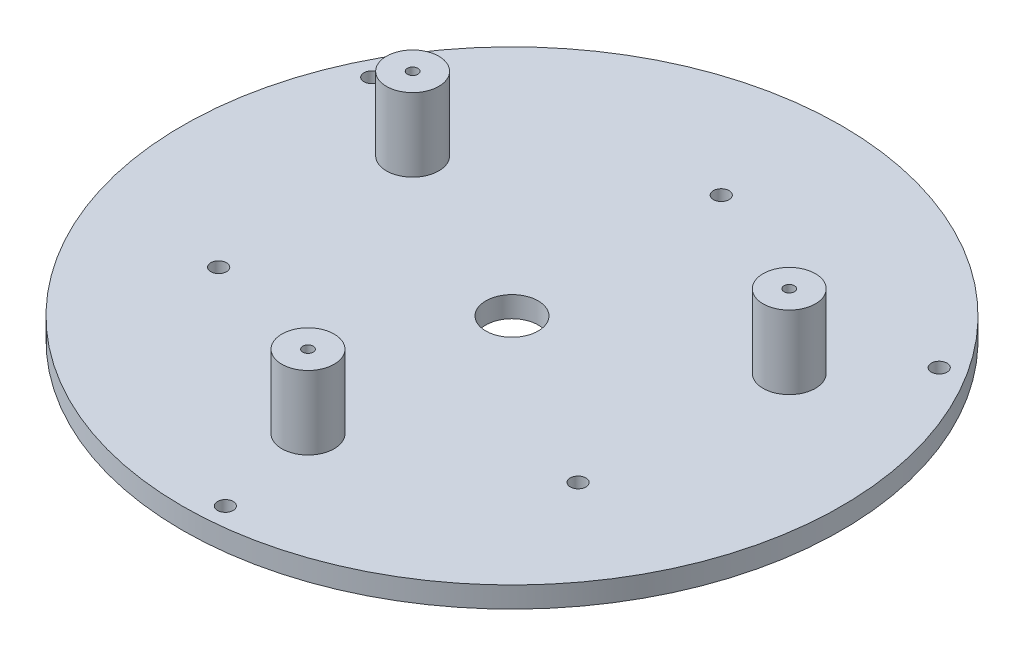
ISO-10303-21;
HEADER;
FILE_DESCRIPTION(('STEP AP214'),'2;1');
FILE_NAME('part.step','',(''),(''),'','','');
FILE_SCHEMA(('AUTOMOTIVE_DESIGN { 1 0 10303 214 1 1 1 1 }'));
ENDSEC;
DATA;
#1=APPLICATION_CONTEXT('core data for automotive mechanical design processes');
#2=APPLICATION_PROTOCOL_DEFINITION('international standard','automotive_design',2000,#1);
#3=PRODUCT_CONTEXT('',#1,'mechanical');
#4=PRODUCT('Part','Part','',(#3));
#5=PRODUCT_RELATED_PRODUCT_CATEGORY('part','',(#4));
#6=PRODUCT_DEFINITION_FORMATION('','',#4);
#7=PRODUCT_DEFINITION_CONTEXT('part definition',#1,'design');
#8=PRODUCT_DEFINITION('design','',#6,#7);
#9=PRODUCT_DEFINITION_SHAPE('','',#8);
#10=(LENGTH_UNIT() NAMED_UNIT(*) SI_UNIT(.MILLI.,.METRE.));
#11=(NAMED_UNIT(*) PLANE_ANGLE_UNIT() SI_UNIT($,.RADIAN.));
#12=(NAMED_UNIT(*) SI_UNIT($,.STERADIAN.) SOLID_ANGLE_UNIT());
#13=UNCERTAINTY_MEASURE_WITH_UNIT(LENGTH_MEASURE(1.E-05),#10,'distance_accuracy_value','');
#14=(GEOMETRIC_REPRESENTATION_CONTEXT(3) GLOBAL_UNCERTAINTY_ASSIGNED_CONTEXT((#13)) GLOBAL_UNIT_ASSIGNED_CONTEXT((#10,
#11,#12)) REPRESENTATION_CONTEXT('',''));
#15=CARTESIAN_POINT('',(0.,0.,0.));
#16=DIRECTION('',(0.,0.,1.));
#17=DIRECTION('',(1.,0.,0.));
#18=AXIS2_PLACEMENT_3D('',#15,#16,#17);
#19=CARTESIAN_POINT('',(0.,4.,0.));
#20=DIRECTION('',(0.,-1.,0.));
#21=DIRECTION('',(0.,0.,-1.));
#22=AXIS2_PLACEMENT_3D('',#19,#20,#21);
#23=CYLINDRICAL_SURFACE('',#22,63.);
#24=CARTESIAN_POINT('',(0.,4.,0.));
#25=DIRECTION('',(0.,1.,0.));
#26=DIRECTION('',(0.,0.,1.));
#27=AXIS2_PLACEMENT_3D('',#24,#25,#26);
#28=CIRCLE('',#27,63.);
#29=CARTESIAN_POINT('',(0.,4.,63.));
#30=VERTEX_POINT('',#29);
#31=EDGE_CURVE('E49',#30,#30,#28,.T.);
#32=ORIENTED_EDGE('',*,*,#31,.F.);
#33=EDGE_LOOP('',(#32));
#34=FACE_BOUND('',#33,.T.);
#35=CARTESIAN_POINT('',(0.,0.,0.));
#36=DIRECTION('',(0.,1.,0.));
#37=DIRECTION('',(0.,0.,1.));
#38=AXIS2_PLACEMENT_3D('',#35,#36,#37);
#39=CIRCLE('',#38,63.);
#40=CARTESIAN_POINT('',(0.,0.,63.));
#41=VERTEX_POINT('',#40);
#42=EDGE_CURVE('E52',#41,#41,#39,.T.);
#43=ORIENTED_EDGE('',*,*,#42,.T.);
#44=EDGE_LOOP('',(#43));
#45=FACE_BOUND('',#44,.T.);
#46=ADVANCED_FACE('F35',(#34,#45),#23,.T.);
#47=CARTESIAN_POINT('',(0.,4.,0.));
#48=DIRECTION('',(0.,1.,0.));
#49=DIRECTION('',(0.,0.,1.));
#50=AXIS2_PLACEMENT_3D('',#47,#48,#49);
#51=PLANE('',#50);
#52=CARTESIAN_POINT('',(4.06318883481198,4.,58.8599226680826));
#53=DIRECTION('',(0.,1.,0.));
#54=DIRECTION('',(0.,0.,1.));
#55=AXIS2_PLACEMENT_3D('',#52,#53,#54);
#56=CIRCLE('',#55,1.5);
#57=CARTESIAN_POINT('',(4.06318883481198,4.,60.3599226680826));
#58=VERTEX_POINT('',#57);
#59=EDGE_CURVE('E98',#58,#58,#56,.F.);
#60=ORIENTED_EDGE('',*,*,#59,.T.);
#61=EDGE_LOOP('',(#60));
#62=FACE_BOUND('',#61,.T.);
#63=CARTESIAN_POINT('',(-52.909524673009,4.,-26.1071292729831));
#64=DIRECTION('',(0.,1.,0.));
#65=DIRECTION('',(0.,0.,1.));
#66=AXIS2_PLACEMENT_3D('',#63,#64,#65);
#67=CIRCLE('',#66,1.5);
#68=CARTESIAN_POINT('',(-52.909524673009,4.,-24.6071292729831));
#69=VERTEX_POINT('',#68);
#70=EDGE_CURVE('E116',#69,#69,#67,.F.);
#71=ORIENTED_EDGE('',*,*,#70,.T.);
#72=EDGE_LOOP('',(#71));
#73=FACE_BOUND('',#72,.T.);
#74=CARTESIAN_POINT('',(49.390475326991,4.,-32.273533227304));
#75=DIRECTION('',(0.,1.,0.));
#76=DIRECTION('',(0.,0.,1.));
#77=AXIS2_PLACEMENT_3D('',#74,#75,#76);
#78=CIRCLE('',#77,1.5);
#79=CARTESIAN_POINT('',(49.390475326991,4.,-30.773533227304));
#80=VERTEX_POINT('',#79);
#81=EDGE_CURVE('E109',#80,#80,#78,.F.);
#82=ORIENTED_EDGE('',*,*,#81,.T.);
#83=EDGE_LOOP('',(#82));
#84=FACE_BOUND('',#83,.T.);
#85=CARTESIAN_POINT('',(33.8886042793149,4.,21.25));
#86=DIRECTION('',(0.,1.,0.));
#87=DIRECTION('',(0.,0.,1.));
#88=AXIS2_PLACEMENT_3D('',#85,#86,#87);
#89=CIRCLE('',#88,1.5);
#90=CARTESIAN_POINT('',(33.8886042793149,4.,22.75));
#91=VERTEX_POINT('',#90);
#92=EDGE_CURVE('E102',#91,#91,#89,.T.);
#93=ORIENTED_EDGE('',*,*,#92,.F.);
#94=EDGE_LOOP('',(#93));
#95=FACE_BOUND('',#94,.T.);
#96=CARTESIAN_POINT('',(-36.0997538421394,4.,19.9733922046847));
#97=DIRECTION('',(0.,1.,0.));
#98=DIRECTION('',(0.,0.,1.));
#99=AXIS2_PLACEMENT_3D('',#96,#97,#98);
#100=CIRCLE('',#99,1.5);
#101=CARTESIAN_POINT('',(-36.0997538421394,4.,21.4733922046847));
#102=VERTEX_POINT('',#101);
#103=EDGE_CURVE('E94',#102,#102,#100,.T.);
#104=ORIENTED_EDGE('',*,*,#103,.F.);
#105=EDGE_LOOP('',(#104));
#106=FACE_BOUND('',#105,.T.);
#107=CARTESIAN_POINT('',(0.,4.,-40.));
#108=DIRECTION('',(0.,1.,0.));
#109=DIRECTION('',(0.,0.,1.));
#110=AXIS2_PLACEMENT_3D('',#107,#108,#109);
#111=CIRCLE('',#110,1.5);
#112=CARTESIAN_POINT('',(0.,4.,-38.5));
#113=VERTEX_POINT('',#112);
#114=EDGE_CURVE('E95',#113,#113,#111,.T.);
#115=ORIENTED_EDGE('',*,*,#114,.F.);
#116=EDGE_LOOP('',(#115));
#117=FACE_BOUND('',#116,.T.);
#118=CARTESIAN_POINT('',(0.,4.,39.));
#119=DIRECTION('',(0.,1.,0.));
#120=DIRECTION('',(0.,0.,1.));
#121=AXIS2_PLACEMENT_3D('',#118,#119,#120);
#122=CIRCLE('',#121,5.);
#123=CARTESIAN_POINT('',(0.,4.,34.));
#124=VERTEX_POINT('',#123);
#125=EDGE_CURVE('E82',#124,#124,#122,.T.);
#126=ORIENTED_EDGE('',*,*,#125,.F.);
#127=EDGE_LOOP('',(#126));
#128=FACE_BOUND('',#127,.T.);
#129=CARTESIAN_POINT('',(36.,4.,-17.));
#130=DIRECTION('',(0.,1.,0.));
#131=DIRECTION('',(0.,0.,1.));
#132=AXIS2_PLACEMENT_3D('',#129,#130,#131);
#133=CIRCLE('',#132,5.);
#134=CARTESIAN_POINT('',(36.,4.,-22.));
#135=VERTEX_POINT('',#134);
#136=EDGE_CURVE('E73',#135,#135,#133,.T.);
#137=ORIENTED_EDGE('',*,*,#136,.F.);
#138=EDGE_LOOP('',(#137));
#139=FACE_BOUND('',#138,.T.);
#140=CARTESIAN_POINT('',(-36.,4.,-17.));
#141=DIRECTION('',(0.,1.,0.));
#142=DIRECTION('',(0.,0.,1.));
#143=AXIS2_PLACEMENT_3D('',#140,#141,#142);
#144=CIRCLE('',#143,5.);
#145=CARTESIAN_POINT('',(-36.,4.,-22.));
#146=VERTEX_POINT('',#145);
#147=EDGE_CURVE('E64',#146,#146,#144,.T.);
#148=ORIENTED_EDGE('',*,*,#147,.F.);
#149=EDGE_LOOP('',(#148));
#150=FACE_BOUND('',#149,.T.);
#151=CARTESIAN_POINT('',(0.,4.,0.));
#152=DIRECTION('',(0.,1.,0.));
#153=DIRECTION('',(0.,0.,1.));
#154=AXIS2_PLACEMENT_3D('',#151,#152,#153);
#155=CIRCLE('',#154,5.);
#156=CARTESIAN_POINT('',(0.,4.,5.));
#157=VERTEX_POINT('',#156);
#158=EDGE_CURVE('E60',#157,#157,#155,.T.);
#159=ORIENTED_EDGE('',*,*,#158,.F.);
#160=EDGE_LOOP('',(#159));
#161=FACE_BOUND('',#160,.T.);
#162=ORIENTED_EDGE('',*,*,#31,.T.);
#163=EDGE_LOOP('',(#162));
#164=FACE_BOUND('',#163,.T.);
#165=ADVANCED_FACE('F134',(#62,#73,#84,#95,#106,#117,#128,#139,#150,#161,#164),#51,.T.);
#166=CARTESIAN_POINT('',(0.,0.,0.));
#167=DIRECTION('',(0.,1.,0.));
#168=DIRECTION('',(0.,0.,1.));
#169=AXIS2_PLACEMENT_3D('',#166,#167,#168);
#170=PLANE('',#169);
#171=CARTESIAN_POINT('',(4.06318883481198,0.,58.8599226680826));
#172=DIRECTION('',(0.,-1.,0.));
#173=DIRECTION('',(0.,0.,-1.));
#174=AXIS2_PLACEMENT_3D('',#171,#172,#173);
#175=CIRCLE('',#174,1.5);
#176=CARTESIAN_POINT('',(4.06318883481198,0.,57.3599226680826));
#177=VERTEX_POINT('',#176);
#178=EDGE_CURVE('E119',#177,#177,#175,.T.);
#179=ORIENTED_EDGE('',*,*,#178,.F.);
#180=EDGE_LOOP('',(#179));
#181=FACE_BOUND('',#180,.T.);
#182=CARTESIAN_POINT('',(-52.909524673009,0.,-26.1071292729831));
#183=DIRECTION('',(0.,-1.,0.));
#184=DIRECTION('',(0.,0.,-1.));
#185=AXIS2_PLACEMENT_3D('',#182,#183,#184);
#186=CIRCLE('',#185,1.5);
#187=CARTESIAN_POINT('',(-52.909524673009,0.,-27.6071292729831));
#188=VERTEX_POINT('',#187);
#189=EDGE_CURVE('E112',#188,#188,#186,.T.);
#190=ORIENTED_EDGE('',*,*,#189,.F.);
#191=EDGE_LOOP('',(#190));
#192=FACE_BOUND('',#191,.T.);
#193=CARTESIAN_POINT('',(49.390475326991,0.,-32.273533227304));
#194=DIRECTION('',(0.,-1.,0.));
#195=DIRECTION('',(0.,0.,-1.));
#196=AXIS2_PLACEMENT_3D('',#193,#194,#195);
#197=CIRCLE('',#196,1.5);
#198=CARTESIAN_POINT('',(49.390475326991,0.,-33.773533227304));
#199=VERTEX_POINT('',#198);
#200=EDGE_CURVE('E113',#199,#199,#197,.T.);
#201=ORIENTED_EDGE('',*,*,#200,.F.);
#202=EDGE_LOOP('',(#201));
#203=FACE_BOUND('',#202,.T.);
#204=CARTESIAN_POINT('',(33.8886042793149,0.,21.25));
#205=DIRECTION('',(0.,1.,0.));
#206=DIRECTION('',(0.,0.,1.));
#207=AXIS2_PLACEMENT_3D('',#204,#205,#206);
#208=CIRCLE('',#207,1.5);
#209=CARTESIAN_POINT('',(33.8886042793149,0.,22.75));
#210=VERTEX_POINT('',#209);
#211=EDGE_CURVE('E90',#210,#210,#208,.F.);
#212=ORIENTED_EDGE('',*,*,#211,.F.);
#213=EDGE_LOOP('',(#212));
#214=FACE_BOUND('',#213,.T.);
#215=CARTESIAN_POINT('',(-36.0997538421394,0.,19.9733922046847));
#216=DIRECTION('',(0.,1.,0.));
#217=DIRECTION('',(0.,0.,1.));
#218=AXIS2_PLACEMENT_3D('',#215,#216,#217);
#219=CIRCLE('',#218,1.5);
#220=CARTESIAN_POINT('',(-36.0997538421394,0.,21.4733922046847));
#221=VERTEX_POINT('',#220);
#222=EDGE_CURVE('E99',#221,#221,#219,.F.);
#223=ORIENTED_EDGE('',*,*,#222,.F.);
#224=EDGE_LOOP('',(#223));
#225=FACE_BOUND('',#224,.T.);
#226=CARTESIAN_POINT('',(0.,0.,-40.));
#227=DIRECTION('',(0.,1.,0.));
#228=DIRECTION('',(0.,0.,1.));
#229=AXIS2_PLACEMENT_3D('',#226,#227,#228);
#230=CIRCLE('',#229,1.5);
#231=CARTESIAN_POINT('',(0.,0.,-38.5));
#232=VERTEX_POINT('',#231);
#233=EDGE_CURVE('E91',#232,#232,#230,.F.);
#234=ORIENTED_EDGE('',*,*,#233,.F.);
#235=EDGE_LOOP('',(#234));
#236=FACE_BOUND('',#235,.T.);
#237=CARTESIAN_POINT('',(0.,0.,0.));
#238=DIRECTION('',(0.,1.,0.));
#239=DIRECTION('',(0.,0.,1.));
#240=AXIS2_PLACEMENT_3D('',#237,#238,#239);
#241=CIRCLE('',#240,5.);
#242=CARTESIAN_POINT('',(0.,0.,5.));
#243=VERTEX_POINT('',#242);
#244=EDGE_CURVE('E55',#243,#243,#241,.F.);
#245=ORIENTED_EDGE('',*,*,#244,.F.);
#246=EDGE_LOOP('',(#245));
#247=FACE_BOUND('',#246,.T.);
#248=ORIENTED_EDGE('',*,*,#42,.F.);
#249=EDGE_LOOP('',(#248));
#250=FACE_BOUND('',#249,.T.);
#251=ADVANCED_FACE('F130',(#181,#192,#203,#214,#225,#236,#247,#250),#170,.F.);
#252=CARTESIAN_POINT('',(0.,-14.1421356237309,0.));
#253=DIRECTION('',(0.,1.,0.));
#254=DIRECTION('',(0.,0.,1.));
#255=AXIS2_PLACEMENT_3D('',#252,#253,#254);
#256=CYLINDRICAL_SURFACE('',#255,5.);
#257=ORIENTED_EDGE('',*,*,#244,.T.);
#258=EDGE_LOOP('',(#257));
#259=FACE_BOUND('',#258,.T.);
#260=ORIENTED_EDGE('',*,*,#158,.T.);
#261=EDGE_LOOP('',(#260));
#262=FACE_BOUND('',#261,.T.);
#263=ADVANCED_FACE('F133',(#259,#262),#256,.F.);
#264=CARTESIAN_POINT('',(-36.,18.,-17.));
#265=DIRECTION('',(0.,1.,0.));
#266=DIRECTION('',(0.,0.,1.));
#267=AXIS2_PLACEMENT_3D('',#264,#265,#266);
#268=PLANE('',#267);
#269=CARTESIAN_POINT('',(-36.,18.,-17.));
#270=DIRECTION('',(0.,1.,0.));
#271=DIRECTION('',(0.,0.,1.));
#272=AXIS2_PLACEMENT_3D('',#269,#270,#271);
#273=CIRCLE('',#272,5.);
#274=CARTESIAN_POINT('',(-36.,18.,-22.));
#275=VERTEX_POINT('',#274);
#276=EDGE_CURVE('E63',#275,#275,#273,.T.);
#277=ORIENTED_EDGE('',*,*,#276,.T.);
#278=EDGE_LOOP('',(#277));
#279=FACE_BOUND('',#278,.T.);
#280=CARTESIAN_POINT('',(-36.,18.,-17.));
#281=DIRECTION('',(0.,1.,0.));
#282=DIRECTION('',(0.,0.,1.));
#283=AXIS2_PLACEMENT_3D('',#280,#281,#282);
#284=CIRCLE('',#283,0.999999999999998);
#285=CARTESIAN_POINT('',(-36.,18.,-18.));
#286=VERTEX_POINT('',#285);
#287=EDGE_CURVE('E67',#286,#286,#284,.T.);
#288=ORIENTED_EDGE('',*,*,#287,.F.);
#289=EDGE_LOOP('',(#288));
#290=FACE_BOUND('',#289,.T.);
#291=ADVANCED_FACE('F204',(#279,#290),#268,.T.);
#292=CARTESIAN_POINT('',(-36.,18.,-17.));
#293=DIRECTION('',(0.,-1.,0.));
#294=DIRECTION('',(0.,0.,-1.));
#295=AXIS2_PLACEMENT_3D('',#292,#293,#294);
#296=CYLINDRICAL_SURFACE('',#295,5.);
#297=CARTESIAN_POINT('',(-36.,18.,-22.));
#298=CARTESIAN_POINT('',(-36.,17.8541666666667,-22.));
#299=CARTESIAN_POINT('',(-36.,17.7083333333333,-22.));
#300=CARTESIAN_POINT('',(-36.,17.4166666666667,-22.));
#301=CARTESIAN_POINT('',(-36.,17.2708333333333,-22.));
#302=CARTESIAN_POINT('',(-36.,16.9791666666667,-22.));
#303=CARTESIAN_POINT('',(-36.,16.8333333333333,-22.));
#304=CARTESIAN_POINT('',(-36.,16.5416666666667,-22.));
#305=CARTESIAN_POINT('',(-36.,16.3958333333333,-22.));
#306=CARTESIAN_POINT('',(-36.,16.1041666666667,-22.));
#307=CARTESIAN_POINT('',(-36.,15.9583333333333,-22.));
#308=CARTESIAN_POINT('',(-36.,15.6666666666667,-22.));
#309=CARTESIAN_POINT('',(-36.,15.5208333333333,-22.));
#310=CARTESIAN_POINT('',(-36.,15.2291666666667,-22.));
#311=CARTESIAN_POINT('',(-36.,15.0833333333333,-22.));
#312=CARTESIAN_POINT('',(-36.,14.7916666666667,-22.));
#313=CARTESIAN_POINT('',(-36.,14.6458333333333,-22.));
#314=CARTESIAN_POINT('',(-36.,14.3541666666667,-22.));
#315=CARTESIAN_POINT('',(-36.,14.2083333333333,-22.));
#316=CARTESIAN_POINT('',(-36.,13.9166666666667,-22.));
#317=CARTESIAN_POINT('',(-36.,13.7708333333333,-22.));
#318=CARTESIAN_POINT('',(-36.,13.4791666666667,-22.));
#319=CARTESIAN_POINT('',(-36.,13.3333333333333,-22.));
#320=CARTESIAN_POINT('',(-36.,13.0416666666667,-22.));
#321=CARTESIAN_POINT('',(-36.,12.8958333333333,-22.));
#322=CARTESIAN_POINT('',(-36.,12.6041666666667,-22.));
#323=CARTESIAN_POINT('',(-36.,12.4583333333333,-22.));
#324=CARTESIAN_POINT('',(-36.,12.1666666666667,-22.));
#325=CARTESIAN_POINT('',(-36.,12.0208333333333,-22.));
#326=CARTESIAN_POINT('',(-36.,11.7291666666667,-22.));
#327=CARTESIAN_POINT('',(-36.,11.5833333333333,-22.));
#328=CARTESIAN_POINT('',(-36.,11.2916666666667,-22.));
#329=CARTESIAN_POINT('',(-36.,11.1458333333333,-22.));
#330=CARTESIAN_POINT('',(-36.,10.8541666666667,-22.));
#331=CARTESIAN_POINT('',(-36.,10.7083333333333,-22.));
#332=CARTESIAN_POINT('',(-36.,10.4166666666667,-22.));
#333=CARTESIAN_POINT('',(-36.,10.2708333333333,-22.));
#334=CARTESIAN_POINT('',(-36.,9.97916666666667,-22.));
#335=CARTESIAN_POINT('',(-36.,9.83333333333333,-22.));
#336=CARTESIAN_POINT('',(-36.,9.54166666666667,-22.));
#337=CARTESIAN_POINT('',(-36.,9.39583333333333,-22.));
#338=CARTESIAN_POINT('',(-36.,9.10416666666666,-22.));
#339=CARTESIAN_POINT('',(-36.,8.95833333333333,-22.));
#340=CARTESIAN_POINT('',(-36.,8.66666666666667,-22.));
#341=CARTESIAN_POINT('',(-36.,8.52083333333333,-22.));
#342=CARTESIAN_POINT('',(-36.,8.22916666666667,-22.));
#343=CARTESIAN_POINT('',(-36.,8.08333333333333,-22.));
#344=CARTESIAN_POINT('',(-36.,7.79166666666666,-22.));
#345=CARTESIAN_POINT('',(-36.,7.64583333333333,-22.));
#346=CARTESIAN_POINT('',(-36.,7.35416666666666,-22.));
#347=CARTESIAN_POINT('',(-36.,7.20833333333333,-22.));
#348=CARTESIAN_POINT('',(-36.,6.91666666666666,-22.));
#349=CARTESIAN_POINT('',(-36.,6.77083333333333,-22.));
#350=CARTESIAN_POINT('',(-36.,6.47916666666667,-22.));
#351=CARTESIAN_POINT('',(-36.,6.33333333333333,-22.));
#352=CARTESIAN_POINT('',(-36.,6.04166666666667,-22.));
#353=CARTESIAN_POINT('',(-36.,5.89583333333333,-22.));
#354=CARTESIAN_POINT('',(-36.,5.60416666666666,-22.));
#355=CARTESIAN_POINT('',(-36.,5.45833333333333,-22.));
#356=CARTESIAN_POINT('',(-36.,5.16666666666667,-22.));
#357=CARTESIAN_POINT('',(-36.,5.02083333333333,-22.));
#358=CARTESIAN_POINT('',(-36.,4.72916666666667,-22.));
#359=CARTESIAN_POINT('',(-36.,4.58333333333333,-22.));
#360=CARTESIAN_POINT('',(-36.,4.29166666666667,-22.));
#361=CARTESIAN_POINT('',(-36.,4.14583333333333,-22.));
#362=CARTESIAN_POINT('',(-36.,4.,-22.));
#363=B_SPLINE_CURVE_WITH_KNOTS('',3,(#297,#298,#299,#300,#301,#302,#303,#304,#305,#306,#307,
#308,#309,#310,#311,#312,#313,#314,#315,#316,#317,#318,#319,#320,#321,#322,#323,#324,#325,#326,
#327,#328,#329,#330,#331,#332,#333,#334,#335,#336,#337,#338,#339,#340,#341,#342,#343,#344,#345,
#346,#347,#348,#349,#350,#351,#352,#353,#354,#355,#356,#357,#358,#359,#360,#361,#362),
.UNSPECIFIED.,.F.,.F.,(4,2,2,2,2,2,2,2,2,2,2,2,2,2,2,2,2,2,2,2,2,2,2,2,2,2,2,2,2,2,2,2,4),(0.,
0.437499999999997,0.874999999999997,1.3125,1.75,2.1875,2.625,3.0625,3.5,3.9375,4.375,4.8125,
5.25,5.6875,6.125,6.5625,7.,7.4375,7.875,8.3125,8.75,9.1875,9.625,10.0625,10.5,10.9375,11.375,
11.8125,12.25,12.6875,13.125,13.5625,14.),.UNSPECIFIED.);
#364=EDGE_CURVE('BSEAM180',#275,#146,#363,.T.);
#365=ORIENTED_EDGE('',*,*,#276,.F.);
#366=ORIENTED_EDGE('',*,*,#147,.T.);
#367=ORIENTED_EDGE('',*,*,#364,.T.);
#368=ORIENTED_EDGE('',*,*,#364,.F.);
#369=EDGE_LOOP('',(#365,#367,#366,#368));
#370=FACE_BOUND('',#369,.T.);
#371=ADVANCED_FACE('F180',(#370),#296,.T.);
#372=CARTESIAN_POINT('',(-36.,18.,-17.));
#373=DIRECTION('',(0.,-1.,0.));
#374=DIRECTION('',(0.,0.,-1.));
#375=AXIS2_PLACEMENT_3D('',#372,#373,#374);
#376=CYLINDRICAL_SURFACE('',#375,0.999999999999998);
#377=CARTESIAN_POINT('',(-36.,4.,-17.));
#378=DIRECTION('',(0.,1.,0.));
#379=DIRECTION('',(0.,0.,1.));
#380=AXIS2_PLACEMENT_3D('',#377,#378,#379);
#381=CIRCLE('',#380,0.999999999999998);
#382=CARTESIAN_POINT('',(-36.,4.,-18.));
#383=VERTEX_POINT('',#382);
#384=EDGE_CURVE('E45',#383,#383,#381,.F.);
#385=CARTESIAN_POINT('',(-36.,18.,-18.));
#386=CARTESIAN_POINT('',(-36.,17.8541666666667,-18.));
#387=CARTESIAN_POINT('',(-36.,17.7083333333333,-18.));
#388=CARTESIAN_POINT('',(-36.,17.4166666666667,-18.));
#389=CARTESIAN_POINT('',(-36.,17.2708333333333,-18.));
#390=CARTESIAN_POINT('',(-36.,16.9791666666667,-18.));
#391=CARTESIAN_POINT('',(-36.,16.8333333333333,-18.));
#392=CARTESIAN_POINT('',(-36.,16.5416666666667,-18.));
#393=CARTESIAN_POINT('',(-36.,16.3958333333333,-18.));
#394=CARTESIAN_POINT('',(-36.,16.1041666666667,-18.));
#395=CARTESIAN_POINT('',(-36.,15.9583333333333,-18.));
#396=CARTESIAN_POINT('',(-36.,15.6666666666667,-18.));
#397=CARTESIAN_POINT('',(-36.,15.5208333333333,-18.));
#398=CARTESIAN_POINT('',(-36.,15.2291666666667,-18.));
#399=CARTESIAN_POINT('',(-36.,15.0833333333333,-18.));
#400=CARTESIAN_POINT('',(-36.,14.7916666666667,-18.));
#401=CARTESIAN_POINT('',(-36.,14.6458333333333,-18.));
#402=CARTESIAN_POINT('',(-36.,14.3541666666667,-18.));
#403=CARTESIAN_POINT('',(-36.,14.2083333333333,-18.));
#404=CARTESIAN_POINT('',(-36.,13.9166666666667,-18.));
#405=CARTESIAN_POINT('',(-36.,13.7708333333333,-18.));
#406=CARTESIAN_POINT('',(-36.,13.4791666666667,-18.));
#407=CARTESIAN_POINT('',(-36.,13.3333333333333,-18.));
#408=CARTESIAN_POINT('',(-36.,13.0416666666667,-18.));
#409=CARTESIAN_POINT('',(-36.,12.8958333333333,-18.));
#410=CARTESIAN_POINT('',(-36.,12.6041666666667,-18.));
#411=CARTESIAN_POINT('',(-36.,12.4583333333333,-18.));
#412=CARTESIAN_POINT('',(-36.,12.1666666666667,-18.));
#413=CARTESIAN_POINT('',(-36.,12.0208333333333,-18.));
#414=CARTESIAN_POINT('',(-36.,11.7291666666667,-18.));
#415=CARTESIAN_POINT('',(-36.,11.5833333333333,-18.));
#416=CARTESIAN_POINT('',(-36.,11.2916666666667,-18.));
#417=CARTESIAN_POINT('',(-36.,11.1458333333333,-18.));
#418=CARTESIAN_POINT('',(-36.,10.8541666666667,-18.));
#419=CARTESIAN_POINT('',(-36.,10.7083333333333,-18.));
#420=CARTESIAN_POINT('',(-36.,10.4166666666667,-18.));
#421=CARTESIAN_POINT('',(-36.,10.2708333333333,-18.));
#422=CARTESIAN_POINT('',(-36.,9.97916666666667,-18.));
#423=CARTESIAN_POINT('',(-36.,9.83333333333333,-18.));
#424=CARTESIAN_POINT('',(-36.,9.54166666666667,-18.));
#425=CARTESIAN_POINT('',(-36.,9.39583333333333,-18.));
#426=CARTESIAN_POINT('',(-36.,9.10416666666666,-18.));
#427=CARTESIAN_POINT('',(-36.,8.95833333333333,-18.));
#428=CARTESIAN_POINT('',(-36.,8.66666666666667,-18.));
#429=CARTESIAN_POINT('',(-36.,8.52083333333333,-18.));
#430=CARTESIAN_POINT('',(-36.,8.22916666666667,-18.));
#431=CARTESIAN_POINT('',(-36.,8.08333333333333,-18.));
#432=CARTESIAN_POINT('',(-36.,7.79166666666666,-18.));
#433=CARTESIAN_POINT('',(-36.,7.64583333333333,-18.));
#434=CARTESIAN_POINT('',(-36.,7.35416666666666,-18.));
#435=CARTESIAN_POINT('',(-36.,7.20833333333333,-18.));
#436=CARTESIAN_POINT('',(-36.,6.91666666666666,-18.));
#437=CARTESIAN_POINT('',(-36.,6.77083333333333,-18.));
#438=CARTESIAN_POINT('',(-36.,6.47916666666667,-18.));
#439=CARTESIAN_POINT('',(-36.,6.33333333333333,-18.));
#440=CARTESIAN_POINT('',(-36.,6.04166666666667,-18.));
#441=CARTESIAN_POINT('',(-36.,5.89583333333333,-18.));
#442=CARTESIAN_POINT('',(-36.,5.60416666666666,-18.));
#443=CARTESIAN_POINT('',(-36.,5.45833333333333,-18.));
#444=CARTESIAN_POINT('',(-36.,5.16666666666667,-18.));
#445=CARTESIAN_POINT('',(-36.,5.02083333333333,-18.));
#446=CARTESIAN_POINT('',(-36.,4.72916666666667,-18.));
#447=CARTESIAN_POINT('',(-36.,4.58333333333333,-18.));
#448=CARTESIAN_POINT('',(-36.,4.29166666666667,-18.));
#449=CARTESIAN_POINT('',(-36.,4.14583333333333,-18.));
#450=CARTESIAN_POINT('',(-36.,4.,-18.));
#451=B_SPLINE_CURVE_WITH_KNOTS('',3,(#385,#386,#387,#388,#389,#390,#391,#392,#393,#394,#395,
#396,#397,#398,#399,#400,#401,#402,#403,#404,#405,#406,#407,#408,#409,#410,#411,#412,#413,#414,
#415,#416,#417,#418,#419,#420,#421,#422,#423,#424,#425,#426,#427,#428,#429,#430,#431,#432,#433,
#434,#435,#436,#437,#438,#439,#440,#441,#442,#443,#444,#445,#446,#447,#448,#449,#450),
.UNSPECIFIED.,.F.,.F.,(4,2,2,2,2,2,2,2,2,2,2,2,2,2,2,2,2,2,2,2,2,2,2,2,2,2,2,2,2,2,2,2,4),(0.,
0.437499999999997,0.874999999999997,1.3125,1.75,2.1875,2.625,3.0625,3.5,3.9375,4.375,4.8125,
5.25,5.6875,6.125,6.5625,7.,7.4375,7.875,8.3125,8.75,9.1875,9.625,10.0625,10.5,10.9375,11.375,
11.8125,12.25,12.6875,13.125,13.5625,14.),.UNSPECIFIED.);
#452=EDGE_CURVE('BSEAM171',#286,#383,#451,.T.);
#453=ORIENTED_EDGE('',*,*,#287,.T.);
#454=ORIENTED_EDGE('',*,*,#384,.T.);
#455=ORIENTED_EDGE('',*,*,#452,.T.);
#456=ORIENTED_EDGE('',*,*,#452,.F.);
#457=EDGE_LOOP('',(#453,#455,#454,#456));
#458=FACE_BOUND('',#457,.T.);
#459=ADVANCED_FACE('F171',(#458),#376,.F.);
#460=ORIENTED_EDGE('',*,*,#384,.F.);
#461=EDGE_LOOP('',(#460));
#462=FACE_BOUND('',#461,.T.);
#463=ADVANCED_FACE('F157',(#462),#51,.T.);
#464=CARTESIAN_POINT('',(36.,18.,-17.));
#465=DIRECTION('',(0.,1.,0.));
#466=DIRECTION('',(0.,0.,1.));
#467=AXIS2_PLACEMENT_3D('',#464,#465,#466);
#468=PLANE('',#467);
#469=CARTESIAN_POINT('',(36.,18.,-17.));
#470=DIRECTION('',(0.,1.,0.));
#471=DIRECTION('',(0.,0.,1.));
#472=AXIS2_PLACEMENT_3D('',#469,#470,#471);
#473=CIRCLE('',#472,5.);
#474=CARTESIAN_POINT('',(36.,18.,-22.));
#475=VERTEX_POINT('',#474);
#476=EDGE_CURVE('E72',#475,#475,#473,.T.);
#477=ORIENTED_EDGE('',*,*,#476,.T.);
#478=EDGE_LOOP('',(#477));
#479=FACE_BOUND('',#478,.T.);
#480=CARTESIAN_POINT('',(36.,18.,-17.));
#481=DIRECTION('',(0.,1.,0.));
#482=DIRECTION('',(0.,0.,1.));
#483=AXIS2_PLACEMENT_3D('',#480,#481,#482);
#484=CIRCLE('',#483,0.999999999999998);
#485=CARTESIAN_POINT('',(36.,18.,-18.));
#486=VERTEX_POINT('',#485);
#487=EDGE_CURVE('E76',#486,#486,#484,.T.);
#488=ORIENTED_EDGE('',*,*,#487,.F.);
#489=EDGE_LOOP('',(#488));
#490=FACE_BOUND('',#489,.T.);
#491=ADVANCED_FACE('F170',(#479,#490),#468,.T.);
#492=CARTESIAN_POINT('',(36.,18.,-17.));
#493=DIRECTION('',(0.,-1.,0.));
#494=DIRECTION('',(0.,0.,-1.));
#495=AXIS2_PLACEMENT_3D('',#492,#493,#494);
#496=CYLINDRICAL_SURFACE('',#495,5.);
#497=CARTESIAN_POINT('',(36.,18.,-22.));
#498=CARTESIAN_POINT('',(36.,17.8541666666667,-22.));
#499=CARTESIAN_POINT('',(36.,17.7083333333333,-22.));
#500=CARTESIAN_POINT('',(36.,17.4166666666667,-22.));
#501=CARTESIAN_POINT('',(36.,17.2708333333333,-22.));
#502=CARTESIAN_POINT('',(36.,16.9791666666667,-22.));
#503=CARTESIAN_POINT('',(36.,16.8333333333333,-22.));
#504=CARTESIAN_POINT('',(36.,16.5416666666667,-22.));
#505=CARTESIAN_POINT('',(36.,16.3958333333333,-22.));
#506=CARTESIAN_POINT('',(36.,16.1041666666667,-22.));
#507=CARTESIAN_POINT('',(36.,15.9583333333333,-22.));
#508=CARTESIAN_POINT('',(36.,15.6666666666667,-22.));
#509=CARTESIAN_POINT('',(36.,15.5208333333333,-22.));
#510=CARTESIAN_POINT('',(36.,15.2291666666667,-22.));
#511=CARTESIAN_POINT('',(36.,15.0833333333333,-22.));
#512=CARTESIAN_POINT('',(36.,14.7916666666667,-22.));
#513=CARTESIAN_POINT('',(36.,14.6458333333333,-22.));
#514=CARTESIAN_POINT('',(36.,14.3541666666667,-22.));
#515=CARTESIAN_POINT('',(36.,14.2083333333333,-22.));
#516=CARTESIAN_POINT('',(36.,13.9166666666667,-22.));
#517=CARTESIAN_POINT('',(36.,13.7708333333333,-22.));
#518=CARTESIAN_POINT('',(36.,13.4791666666667,-22.));
#519=CARTESIAN_POINT('',(36.,13.3333333333333,-22.));
#520=CARTESIAN_POINT('',(36.,13.0416666666667,-22.));
#521=CARTESIAN_POINT('',(36.,12.8958333333333,-22.));
#522=CARTESIAN_POINT('',(36.,12.6041666666667,-22.));
#523=CARTESIAN_POINT('',(36.,12.4583333333333,-22.));
#524=CARTESIAN_POINT('',(36.,12.1666666666667,-22.));
#525=CARTESIAN_POINT('',(36.,12.0208333333333,-22.));
#526=CARTESIAN_POINT('',(36.,11.7291666666667,-22.));
#527=CARTESIAN_POINT('',(36.,11.5833333333333,-22.));
#528=CARTESIAN_POINT('',(36.,11.2916666666667,-22.));
#529=CARTESIAN_POINT('',(36.,11.1458333333333,-22.));
#530=CARTESIAN_POINT('',(36.,10.8541666666667,-22.));
#531=CARTESIAN_POINT('',(36.,10.7083333333333,-22.));
#532=CARTESIAN_POINT('',(36.,10.4166666666667,-22.));
#533=CARTESIAN_POINT('',(36.,10.2708333333333,-22.));
#534=CARTESIAN_POINT('',(36.,9.97916666666667,-22.));
#535=CARTESIAN_POINT('',(36.,9.83333333333333,-22.));
#536=CARTESIAN_POINT('',(36.,9.54166666666667,-22.));
#537=CARTESIAN_POINT('',(36.,9.39583333333333,-22.));
#538=CARTESIAN_POINT('',(36.,9.10416666666666,-22.));
#539=CARTESIAN_POINT('',(36.,8.95833333333333,-22.));
#540=CARTESIAN_POINT('',(36.,8.66666666666667,-22.));
#541=CARTESIAN_POINT('',(36.,8.52083333333333,-22.));
#542=CARTESIAN_POINT('',(36.,8.22916666666667,-22.));
#543=CARTESIAN_POINT('',(36.,8.08333333333333,-22.));
#544=CARTESIAN_POINT('',(36.,7.79166666666666,-22.));
#545=CARTESIAN_POINT('',(36.,7.64583333333333,-22.));
#546=CARTESIAN_POINT('',(36.,7.35416666666666,-22.));
#547=CARTESIAN_POINT('',(36.,7.20833333333333,-22.));
#548=CARTESIAN_POINT('',(36.,6.91666666666666,-22.));
#549=CARTESIAN_POINT('',(36.,6.77083333333333,-22.));
#550=CARTESIAN_POINT('',(36.,6.47916666666667,-22.));
#551=CARTESIAN_POINT('',(36.,6.33333333333333,-22.));
#552=CARTESIAN_POINT('',(36.,6.04166666666667,-22.));
#553=CARTESIAN_POINT('',(36.,5.89583333333333,-22.));
#554=CARTESIAN_POINT('',(36.,5.60416666666666,-22.));
#555=CARTESIAN_POINT('',(36.,5.45833333333333,-22.));
#556=CARTESIAN_POINT('',(36.,5.16666666666667,-22.));
#557=CARTESIAN_POINT('',(36.,5.02083333333333,-22.));
#558=CARTESIAN_POINT('',(36.,4.72916666666667,-22.));
#559=CARTESIAN_POINT('',(36.,4.58333333333333,-22.));
#560=CARTESIAN_POINT('',(36.,4.29166666666667,-22.));
#561=CARTESIAN_POINT('',(36.,4.14583333333333,-22.));
#562=CARTESIAN_POINT('',(36.,4.,-22.));
#563=B_SPLINE_CURVE_WITH_KNOTS('',3,(#497,#498,#499,#500,#501,#502,#503,#504,#505,#506,#507,
#508,#509,#510,#511,#512,#513,#514,#515,#516,#517,#518,#519,#520,#521,#522,#523,#524,#525,#526,
#527,#528,#529,#530,#531,#532,#533,#534,#535,#536,#537,#538,#539,#540,#541,#542,#543,#544,#545,
#546,#547,#548,#549,#550,#551,#552,#553,#554,#555,#556,#557,#558,#559,#560,#561,#562),
.UNSPECIFIED.,.F.,.F.,(4,2,2,2,2,2,2,2,2,2,2,2,2,2,2,2,2,2,2,2,2,2,2,2,2,2,2,2,2,2,2,2,4),(0.,
0.437499999999997,0.874999999999997,1.3125,1.75,2.1875,2.625,3.0625,3.5,3.9375,4.375,4.8125,
5.25,5.6875,6.125,6.5625,7.,7.4375,7.875,8.3125,8.75,9.1875,9.625,10.0625,10.5,10.9375,11.375,
11.8125,12.25,12.6875,13.125,13.5625,14.),.UNSPECIFIED.);
#564=EDGE_CURVE('BSEAM177',#475,#135,#563,.T.);
#565=ORIENTED_EDGE('',*,*,#476,.F.);
#566=ORIENTED_EDGE('',*,*,#136,.T.);
#567=ORIENTED_EDGE('',*,*,#564,.T.);
#568=ORIENTED_EDGE('',*,*,#564,.F.);
#569=EDGE_LOOP('',(#565,#567,#566,#568));
#570=FACE_BOUND('',#569,.T.);
#571=ADVANCED_FACE('F177',(#570),#496,.T.);
#572=CARTESIAN_POINT('',(36.,18.,-17.));
#573=DIRECTION('',(0.,-1.,0.));
#574=DIRECTION('',(0.,0.,-1.));
#575=AXIS2_PLACEMENT_3D('',#572,#573,#574);
#576=CYLINDRICAL_SURFACE('',#575,0.999999999999998);
#577=CARTESIAN_POINT('',(36.,4.,-17.));
#578=DIRECTION('',(0.,1.,0.));
#579=DIRECTION('',(0.,0.,1.));
#580=AXIS2_PLACEMENT_3D('',#577,#578,#579);
#581=CIRCLE('',#580,0.999999999999998);
#582=CARTESIAN_POINT('',(36.,4.,-18.));
#583=VERTEX_POINT('',#582);
#584=EDGE_CURVE('E41',#583,#583,#581,.F.);
#585=CARTESIAN_POINT('',(36.,18.,-18.));
#586=CARTESIAN_POINT('',(36.,17.8541666666667,-18.));
#587=CARTESIAN_POINT('',(36.,17.7083333333333,-18.));
#588=CARTESIAN_POINT('',(36.,17.4166666666667,-18.));
#589=CARTESIAN_POINT('',(36.,17.2708333333333,-18.));
#590=CARTESIAN_POINT('',(36.,16.9791666666667,-18.));
#591=CARTESIAN_POINT('',(36.,16.8333333333333,-18.));
#592=CARTESIAN_POINT('',(36.,16.5416666666667,-18.));
#593=CARTESIAN_POINT('',(36.,16.3958333333333,-18.));
#594=CARTESIAN_POINT('',(36.,16.1041666666667,-18.));
#595=CARTESIAN_POINT('',(36.,15.9583333333333,-18.));
#596=CARTESIAN_POINT('',(36.,15.6666666666667,-18.));
#597=CARTESIAN_POINT('',(36.,15.5208333333333,-18.));
#598=CARTESIAN_POINT('',(36.,15.2291666666667,-18.));
#599=CARTESIAN_POINT('',(36.,15.0833333333333,-18.));
#600=CARTESIAN_POINT('',(36.,14.7916666666667,-18.));
#601=CARTESIAN_POINT('',(36.,14.6458333333333,-18.));
#602=CARTESIAN_POINT('',(36.,14.3541666666667,-18.));
#603=CARTESIAN_POINT('',(36.,14.2083333333333,-18.));
#604=CARTESIAN_POINT('',(36.,13.9166666666667,-18.));
#605=CARTESIAN_POINT('',(36.,13.7708333333333,-18.));
#606=CARTESIAN_POINT('',(36.,13.4791666666667,-18.));
#607=CARTESIAN_POINT('',(36.,13.3333333333333,-18.));
#608=CARTESIAN_POINT('',(36.,13.0416666666667,-18.));
#609=CARTESIAN_POINT('',(36.,12.8958333333333,-18.));
#610=CARTESIAN_POINT('',(36.,12.6041666666667,-18.));
#611=CARTESIAN_POINT('',(36.,12.4583333333333,-18.));
#612=CARTESIAN_POINT('',(36.,12.1666666666667,-18.));
#613=CARTESIAN_POINT('',(36.,12.0208333333333,-18.));
#614=CARTESIAN_POINT('',(36.,11.7291666666667,-18.));
#615=CARTESIAN_POINT('',(36.,11.5833333333333,-18.));
#616=CARTESIAN_POINT('',(36.,11.2916666666667,-18.));
#617=CARTESIAN_POINT('',(36.,11.1458333333333,-18.));
#618=CARTESIAN_POINT('',(36.,10.8541666666667,-18.));
#619=CARTESIAN_POINT('',(36.,10.7083333333333,-18.));
#620=CARTESIAN_POINT('',(36.,10.4166666666667,-18.));
#621=CARTESIAN_POINT('',(36.,10.2708333333333,-18.));
#622=CARTESIAN_POINT('',(36.,9.97916666666667,-18.));
#623=CARTESIAN_POINT('',(36.,9.83333333333333,-18.));
#624=CARTESIAN_POINT('',(36.,9.54166666666667,-18.));
#625=CARTESIAN_POINT('',(36.,9.39583333333333,-18.));
#626=CARTESIAN_POINT('',(36.,9.10416666666666,-18.));
#627=CARTESIAN_POINT('',(36.,8.95833333333333,-18.));
#628=CARTESIAN_POINT('',(36.,8.66666666666667,-18.));
#629=CARTESIAN_POINT('',(36.,8.52083333333333,-18.));
#630=CARTESIAN_POINT('',(36.,8.22916666666667,-18.));
#631=CARTESIAN_POINT('',(36.,8.08333333333333,-18.));
#632=CARTESIAN_POINT('',(36.,7.79166666666666,-18.));
#633=CARTESIAN_POINT('',(36.,7.64583333333333,-18.));
#634=CARTESIAN_POINT('',(36.,7.35416666666666,-18.));
#635=CARTESIAN_POINT('',(36.,7.20833333333333,-18.));
#636=CARTESIAN_POINT('',(36.,6.91666666666666,-18.));
#637=CARTESIAN_POINT('',(36.,6.77083333333333,-18.));
#638=CARTESIAN_POINT('',(36.,6.47916666666667,-18.));
#639=CARTESIAN_POINT('',(36.,6.33333333333333,-18.));
#640=CARTESIAN_POINT('',(36.,6.04166666666667,-18.));
#641=CARTESIAN_POINT('',(36.,5.89583333333333,-18.));
#642=CARTESIAN_POINT('',(36.,5.60416666666666,-18.));
#643=CARTESIAN_POINT('',(36.,5.45833333333333,-18.));
#644=CARTESIAN_POINT('',(36.,5.16666666666667,-18.));
#645=CARTESIAN_POINT('',(36.,5.02083333333333,-18.));
#646=CARTESIAN_POINT('',(36.,4.72916666666667,-18.));
#647=CARTESIAN_POINT('',(36.,4.58333333333333,-18.));
#648=CARTESIAN_POINT('',(36.,4.29166666666667,-18.));
#649=CARTESIAN_POINT('',(36.,4.14583333333333,-18.));
#650=CARTESIAN_POINT('',(36.,4.,-18.));
#651=B_SPLINE_CURVE_WITH_KNOTS('',3,(#585,#586,#587,#588,#589,#590,#591,#592,#593,#594,#595,
#596,#597,#598,#599,#600,#601,#602,#603,#604,#605,#606,#607,#608,#609,#610,#611,#612,#613,#614,
#615,#616,#617,#618,#619,#620,#621,#622,#623,#624,#625,#626,#627,#628,#629,#630,#631,#632,#633,
#634,#635,#636,#637,#638,#639,#640,#641,#642,#643,#644,#645,#646,#647,#648,#649,#650),
.UNSPECIFIED.,.F.,.F.,(4,2,2,2,2,2,2,2,2,2,2,2,2,2,2,2,2,2,2,2,2,2,2,2,2,2,2,2,2,2,2,2,4),(0.,
0.437499999999997,0.874999999999997,1.3125,1.75,2.1875,2.625,3.0625,3.5,3.9375,4.375,4.8125,
5.25,5.6875,6.125,6.5625,7.,7.4375,7.875,8.3125,8.75,9.1875,9.625,10.0625,10.5,10.9375,11.375,
11.8125,12.25,12.6875,13.125,13.5625,14.),.UNSPECIFIED.);
#652=EDGE_CURVE('BSEAM186',#486,#583,#651,.T.);
#653=ORIENTED_EDGE('',*,*,#487,.T.);
#654=ORIENTED_EDGE('',*,*,#584,.T.);
#655=ORIENTED_EDGE('',*,*,#652,.T.);
#656=ORIENTED_EDGE('',*,*,#652,.F.);
#657=EDGE_LOOP('',(#653,#655,#654,#656));
#658=FACE_BOUND('',#657,.T.);
#659=ADVANCED_FACE('F186',(#658),#576,.F.);
#660=ORIENTED_EDGE('',*,*,#584,.F.);
#661=EDGE_LOOP('',(#660));
#662=FACE_BOUND('',#661,.T.);
#663=ADVANCED_FACE('F168',(#662),#51,.T.);
#664=CARTESIAN_POINT('',(0.,18.,39.));
#665=DIRECTION('',(0.,1.,0.));
#666=DIRECTION('',(0.,0.,1.));
#667=AXIS2_PLACEMENT_3D('',#664,#665,#666);
#668=PLANE('',#667);
#669=CARTESIAN_POINT('',(0.,18.,39.));
#670=DIRECTION('',(0.,1.,0.));
#671=DIRECTION('',(0.,0.,1.));
#672=AXIS2_PLACEMENT_3D('',#669,#670,#671);
#673=CIRCLE('',#672,5.);
#674=CARTESIAN_POINT('',(0.,18.,34.));
#675=VERTEX_POINT('',#674);
#676=EDGE_CURVE('E81',#675,#675,#673,.T.);
#677=ORIENTED_EDGE('',*,*,#676,.T.);
#678=EDGE_LOOP('',(#677));
#679=FACE_BOUND('',#678,.T.);
#680=CARTESIAN_POINT('',(0.,18.,39.));
#681=DIRECTION('',(0.,1.,0.));
#682=DIRECTION('',(0.,0.,1.));
#683=AXIS2_PLACEMENT_3D('',#680,#681,#682);
#684=CIRCLE('',#683,1.);
#685=CARTESIAN_POINT('',(0.,18.,38.));
#686=VERTEX_POINT('',#685);
#687=EDGE_CURVE('E85',#686,#686,#684,.T.);
#688=ORIENTED_EDGE('',*,*,#687,.F.);
#689=EDGE_LOOP('',(#688));
#690=FACE_BOUND('',#689,.T.);
#691=ADVANCED_FACE('F185',(#679,#690),#668,.T.);
#692=CARTESIAN_POINT('',(0.,18.,39.));
#693=DIRECTION('',(0.,-1.,0.));
#694=DIRECTION('',(0.,0.,-1.));
#695=AXIS2_PLACEMENT_3D('',#692,#693,#694);
#696=CYLINDRICAL_SURFACE('',#695,5.);
#697=CARTESIAN_POINT('',(0.,18.,34.));
#698=CARTESIAN_POINT('',(0.,17.8541666666667,34.));
#699=CARTESIAN_POINT('',(0.,17.7083333333333,34.));
#700=CARTESIAN_POINT('',(0.,17.4166666666667,34.));
#701=CARTESIAN_POINT('',(0.,17.2708333333333,34.));
#702=CARTESIAN_POINT('',(0.,16.9791666666667,34.));
#703=CARTESIAN_POINT('',(0.,16.8333333333333,34.));
#704=CARTESIAN_POINT('',(0.,16.5416666666667,34.));
#705=CARTESIAN_POINT('',(0.,16.3958333333333,34.));
#706=CARTESIAN_POINT('',(0.,16.1041666666667,34.));
#707=CARTESIAN_POINT('',(0.,15.9583333333333,34.));
#708=CARTESIAN_POINT('',(0.,15.6666666666667,34.));
#709=CARTESIAN_POINT('',(0.,15.5208333333333,34.));
#710=CARTESIAN_POINT('',(0.,15.2291666666667,34.));
#711=CARTESIAN_POINT('',(0.,15.0833333333333,34.));
#712=CARTESIAN_POINT('',(0.,14.7916666666667,34.));
#713=CARTESIAN_POINT('',(0.,14.6458333333333,34.));
#714=CARTESIAN_POINT('',(0.,14.3541666666667,34.));
#715=CARTESIAN_POINT('',(0.,14.2083333333333,34.));
#716=CARTESIAN_POINT('',(0.,13.9166666666667,34.));
#717=CARTESIAN_POINT('',(0.,13.7708333333333,34.));
#718=CARTESIAN_POINT('',(0.,13.4791666666667,34.));
#719=CARTESIAN_POINT('',(0.,13.3333333333333,34.));
#720=CARTESIAN_POINT('',(0.,13.0416666666667,34.));
#721=CARTESIAN_POINT('',(0.,12.8958333333333,34.));
#722=CARTESIAN_POINT('',(0.,12.6041666666667,34.));
#723=CARTESIAN_POINT('',(0.,12.4583333333333,34.));
#724=CARTESIAN_POINT('',(0.,12.1666666666667,34.));
#725=CARTESIAN_POINT('',(0.,12.0208333333333,34.));
#726=CARTESIAN_POINT('',(0.,11.7291666666667,34.));
#727=CARTESIAN_POINT('',(0.,11.5833333333333,34.));
#728=CARTESIAN_POINT('',(0.,11.2916666666667,34.));
#729=CARTESIAN_POINT('',(0.,11.1458333333333,34.));
#730=CARTESIAN_POINT('',(0.,10.8541666666667,34.));
#731=CARTESIAN_POINT('',(0.,10.7083333333333,34.));
#732=CARTESIAN_POINT('',(0.,10.4166666666667,34.));
#733=CARTESIAN_POINT('',(0.,10.2708333333333,34.));
#734=CARTESIAN_POINT('',(0.,9.97916666666667,34.));
#735=CARTESIAN_POINT('',(0.,9.83333333333333,34.));
#736=CARTESIAN_POINT('',(0.,9.54166666666667,34.));
#737=CARTESIAN_POINT('',(0.,9.39583333333333,34.));
#738=CARTESIAN_POINT('',(0.,9.10416666666666,34.));
#739=CARTESIAN_POINT('',(0.,8.95833333333333,34.));
#740=CARTESIAN_POINT('',(0.,8.66666666666667,34.));
#741=CARTESIAN_POINT('',(0.,8.52083333333333,34.));
#742=CARTESIAN_POINT('',(0.,8.22916666666667,34.));
#743=CARTESIAN_POINT('',(0.,8.08333333333333,34.));
#744=CARTESIAN_POINT('',(0.,7.79166666666666,34.));
#745=CARTESIAN_POINT('',(0.,7.64583333333333,34.));
#746=CARTESIAN_POINT('',(0.,7.35416666666666,34.));
#747=CARTESIAN_POINT('',(0.,7.20833333333333,34.));
#748=CARTESIAN_POINT('',(0.,6.91666666666666,34.));
#749=CARTESIAN_POINT('',(0.,6.77083333333333,34.));
#750=CARTESIAN_POINT('',(0.,6.47916666666667,34.));
#751=CARTESIAN_POINT('',(0.,6.33333333333333,34.));
#752=CARTESIAN_POINT('',(0.,6.04166666666667,34.));
#753=CARTESIAN_POINT('',(0.,5.89583333333333,34.));
#754=CARTESIAN_POINT('',(0.,5.60416666666666,34.));
#755=CARTESIAN_POINT('',(0.,5.45833333333333,34.));
#756=CARTESIAN_POINT('',(0.,5.16666666666667,34.));
#757=CARTESIAN_POINT('',(0.,5.02083333333333,34.));
#758=CARTESIAN_POINT('',(0.,4.72916666666667,34.));
#759=CARTESIAN_POINT('',(0.,4.58333333333333,34.));
#760=CARTESIAN_POINT('',(0.,4.29166666666667,34.));
#761=CARTESIAN_POINT('',(0.,4.14583333333333,34.));
#762=CARTESIAN_POINT('',(0.,4.,34.));
#763=B_SPLINE_CURVE_WITH_KNOTS('',3,(#697,#698,#699,#700,#701,#702,#703,#704,#705,#706,#707,
#708,#709,#710,#711,#712,#713,#714,#715,#716,#717,#718,#719,#720,#721,#722,#723,#724,#725,#726,
#727,#728,#729,#730,#731,#732,#733,#734,#735,#736,#737,#738,#739,#740,#741,#742,#743,#744,#745,
#746,#747,#748,#749,#750,#751,#752,#753,#754,#755,#756,#757,#758,#759,#760,#761,#762),
.UNSPECIFIED.,.F.,.F.,(4,2,2,2,2,2,2,2,2,2,2,2,2,2,2,2,2,2,2,2,2,2,2,2,2,2,2,2,2,2,2,2,4),(0.,
0.437499999999997,0.874999999999997,1.3125,1.75,2.1875,2.625,3.0625,3.5,3.9375,4.375,4.8125,
5.25,5.6875,6.125,6.5625,7.,7.4375,7.875,8.3125,8.75,9.1875,9.625,10.0625,10.5,10.9375,11.375,
11.8125,12.25,12.6875,13.125,13.5625,14.),.UNSPECIFIED.);
#764=EDGE_CURVE('BSEAM192',#675,#124,#763,.T.);
#765=ORIENTED_EDGE('',*,*,#676,.F.);
#766=ORIENTED_EDGE('',*,*,#125,.T.);
#767=ORIENTED_EDGE('',*,*,#764,.T.);
#768=ORIENTED_EDGE('',*,*,#764,.F.);
#769=EDGE_LOOP('',(#765,#767,#766,#768));
#770=FACE_BOUND('',#769,.T.);
#771=ADVANCED_FACE('F192',(#770),#696,.T.);
#772=CARTESIAN_POINT('',(0.,18.,39.));
#773=DIRECTION('',(0.,-1.,0.));
#774=DIRECTION('',(0.,0.,-1.));
#775=AXIS2_PLACEMENT_3D('',#772,#773,#774);
#776=CYLINDRICAL_SURFACE('',#775,1.);
#777=CARTESIAN_POINT('',(0.,4.,39.));
#778=DIRECTION('',(0.,1.,0.));
#779=DIRECTION('',(0.,0.,1.));
#780=AXIS2_PLACEMENT_3D('',#777,#778,#779);
#781=CIRCLE('',#780,1.);
#782=CARTESIAN_POINT('',(0.,4.,38.));
#783=VERTEX_POINT('',#782);
#784=EDGE_CURVE('E10',#783,#783,#781,.F.);
#785=CARTESIAN_POINT('',(0.,18.,38.));
#786=CARTESIAN_POINT('',(0.,17.8541666666667,38.));
#787=CARTESIAN_POINT('',(0.,17.7083333333333,38.));
#788=CARTESIAN_POINT('',(0.,17.4166666666667,38.));
#789=CARTESIAN_POINT('',(0.,17.2708333333333,38.));
#790=CARTESIAN_POINT('',(0.,16.9791666666667,38.));
#791=CARTESIAN_POINT('',(0.,16.8333333333333,38.));
#792=CARTESIAN_POINT('',(0.,16.5416666666667,38.));
#793=CARTESIAN_POINT('',(0.,16.3958333333333,38.));
#794=CARTESIAN_POINT('',(0.,16.1041666666667,38.));
#795=CARTESIAN_POINT('',(0.,15.9583333333333,38.));
#796=CARTESIAN_POINT('',(0.,15.6666666666667,38.));
#797=CARTESIAN_POINT('',(0.,15.5208333333333,38.));
#798=CARTESIAN_POINT('',(0.,15.2291666666667,38.));
#799=CARTESIAN_POINT('',(0.,15.0833333333333,38.));
#800=CARTESIAN_POINT('',(0.,14.7916666666667,38.));
#801=CARTESIAN_POINT('',(0.,14.6458333333333,38.));
#802=CARTESIAN_POINT('',(0.,14.3541666666667,38.));
#803=CARTESIAN_POINT('',(0.,14.2083333333333,38.));
#804=CARTESIAN_POINT('',(0.,13.9166666666667,38.));
#805=CARTESIAN_POINT('',(0.,13.7708333333333,38.));
#806=CARTESIAN_POINT('',(0.,13.4791666666667,38.));
#807=CARTESIAN_POINT('',(0.,13.3333333333333,38.));
#808=CARTESIAN_POINT('',(0.,13.0416666666667,38.));
#809=CARTESIAN_POINT('',(0.,12.8958333333333,38.));
#810=CARTESIAN_POINT('',(0.,12.6041666666667,38.));
#811=CARTESIAN_POINT('',(0.,12.4583333333333,38.));
#812=CARTESIAN_POINT('',(0.,12.1666666666667,38.));
#813=CARTESIAN_POINT('',(0.,12.0208333333333,38.));
#814=CARTESIAN_POINT('',(0.,11.7291666666667,38.));
#815=CARTESIAN_POINT('',(0.,11.5833333333333,38.));
#816=CARTESIAN_POINT('',(0.,11.2916666666667,38.));
#817=CARTESIAN_POINT('',(0.,11.1458333333333,38.));
#818=CARTESIAN_POINT('',(0.,10.8541666666667,38.));
#819=CARTESIAN_POINT('',(0.,10.7083333333333,38.));
#820=CARTESIAN_POINT('',(0.,10.4166666666667,38.));
#821=CARTESIAN_POINT('',(0.,10.2708333333333,38.));
#822=CARTESIAN_POINT('',(0.,9.97916666666667,38.));
#823=CARTESIAN_POINT('',(0.,9.83333333333333,38.));
#824=CARTESIAN_POINT('',(0.,9.54166666666667,38.));
#825=CARTESIAN_POINT('',(0.,9.39583333333333,38.));
#826=CARTESIAN_POINT('',(0.,9.10416666666666,38.));
#827=CARTESIAN_POINT('',(0.,8.95833333333333,38.));
#828=CARTESIAN_POINT('',(0.,8.66666666666667,38.));
#829=CARTESIAN_POINT('',(0.,8.52083333333333,38.));
#830=CARTESIAN_POINT('',(0.,8.22916666666667,38.));
#831=CARTESIAN_POINT('',(0.,8.08333333333333,38.));
#832=CARTESIAN_POINT('',(0.,7.79166666666666,38.));
#833=CARTESIAN_POINT('',(0.,7.64583333333333,38.));
#834=CARTESIAN_POINT('',(0.,7.35416666666666,38.));
#835=CARTESIAN_POINT('',(0.,7.20833333333333,38.));
#836=CARTESIAN_POINT('',(0.,6.91666666666666,38.));
#837=CARTESIAN_POINT('',(0.,6.77083333333333,38.));
#838=CARTESIAN_POINT('',(0.,6.47916666666667,38.));
#839=CARTESIAN_POINT('',(0.,6.33333333333333,38.));
#840=CARTESIAN_POINT('',(0.,6.04166666666667,38.));
#841=CARTESIAN_POINT('',(0.,5.89583333333333,38.));
#842=CARTESIAN_POINT('',(0.,5.60416666666666,38.));
#843=CARTESIAN_POINT('',(0.,5.45833333333333,38.));
#844=CARTESIAN_POINT('',(0.,5.16666666666667,38.));
#845=CARTESIAN_POINT('',(0.,5.02083333333333,38.));
#846=CARTESIAN_POINT('',(0.,4.72916666666667,38.));
#847=CARTESIAN_POINT('',(0.,4.58333333333333,38.));
#848=CARTESIAN_POINT('',(0.,4.29166666666667,38.));
#849=CARTESIAN_POINT('',(0.,4.14583333333333,38.));
#850=CARTESIAN_POINT('',(0.,4.,38.));
#851=B_SPLINE_CURVE_WITH_KNOTS('',3,(#785,#786,#787,#788,#789,#790,#791,#792,#793,#794,#795,
#796,#797,#798,#799,#800,#801,#802,#803,#804,#805,#806,#807,#808,#809,#810,#811,#812,#813,#814,
#815,#816,#817,#818,#819,#820,#821,#822,#823,#824,#825,#826,#827,#828,#829,#830,#831,#832,#833,
#834,#835,#836,#837,#838,#839,#840,#841,#842,#843,#844,#845,#846,#847,#848,#849,#850),
.UNSPECIFIED.,.F.,.F.,(4,2,2,2,2,2,2,2,2,2,2,2,2,2,2,2,2,2,2,2,2,2,2,2,2,2,2,2,2,2,2,2,4),(0.,
0.437499999999997,0.874999999999997,1.3125,1.75,2.1875,2.625,3.0625,3.5,3.9375,4.375,4.8125,
5.25,5.6875,6.125,6.5625,7.,7.4375,7.875,8.3125,8.75,9.1875,9.625,10.0625,10.5,10.9375,11.375,
11.8125,12.25,12.6875,13.125,13.5625,14.),.UNSPECIFIED.);
#852=EDGE_CURVE('BSEAM166',#686,#783,#851,.T.);
#853=ORIENTED_EDGE('',*,*,#687,.T.);
#854=ORIENTED_EDGE('',*,*,#784,.T.);
#855=ORIENTED_EDGE('',*,*,#852,.T.);
#856=ORIENTED_EDGE('',*,*,#852,.F.);
#857=EDGE_LOOP('',(#853,#855,#854,#856));
#858=FACE_BOUND('',#857,.T.);
#859=ADVANCED_FACE('F166',(#858),#776,.F.);
#860=ORIENTED_EDGE('',*,*,#784,.F.);
#861=EDGE_LOOP('',(#860));
#862=FACE_BOUND('',#861,.T.);
#863=ADVANCED_FACE('F156',(#862),#51,.T.);
#864=CARTESIAN_POINT('',(0.,-4.24264068711929,-40.));
#865=DIRECTION('',(0.,1.,0.));
#866=DIRECTION('',(0.,0.,1.));
#867=AXIS2_PLACEMENT_3D('',#864,#865,#866);
#868=CYLINDRICAL_SURFACE('',#867,1.5);
#869=ORIENTED_EDGE('',*,*,#233,.T.);
#870=EDGE_LOOP('',(#869));
#871=FACE_BOUND('',#870,.T.);
#872=ORIENTED_EDGE('',*,*,#114,.T.);
#873=EDGE_LOOP('',(#872));
#874=FACE_BOUND('',#873,.T.);
#875=ADVANCED_FACE('F165',(#871,#874),#868,.F.);
#876=CARTESIAN_POINT('',(-36.0997538421394,-4.24264068711929,19.9733922046847));
#877=DIRECTION('',(0.,1.,0.));
#878=DIRECTION('',(0.,0.,1.));
#879=AXIS2_PLACEMENT_3D('',#876,#877,#878);
#880=CYLINDRICAL_SURFACE('',#879,1.5);
#881=ORIENTED_EDGE('',*,*,#222,.T.);
#882=EDGE_LOOP('',(#881));
#883=FACE_BOUND('',#882,.T.);
#884=ORIENTED_EDGE('',*,*,#103,.T.);
#885=EDGE_LOOP('',(#884));
#886=FACE_BOUND('',#885,.T.);
#887=ADVANCED_FACE('F293',(#883,#886),#880,.F.);
#888=CARTESIAN_POINT('',(33.8886042793149,-4.24264068711929,21.25));
#889=DIRECTION('',(0.,1.,0.));
#890=DIRECTION('',(0.,0.,1.));
#891=AXIS2_PLACEMENT_3D('',#888,#889,#890);
#892=CYLINDRICAL_SURFACE('',#891,1.5);
#893=ORIENTED_EDGE('',*,*,#211,.T.);
#894=EDGE_LOOP('',(#893));
#895=FACE_BOUND('',#894,.T.);
#896=ORIENTED_EDGE('',*,*,#92,.T.);
#897=EDGE_LOOP('',(#896));
#898=FACE_BOUND('',#897,.T.);
#899=ADVANCED_FACE('F303',(#895,#898),#892,.F.);
#900=CARTESIAN_POINT('',(49.390475326991,8.24264068711929,-32.273533227304));
#901=DIRECTION('',(0.,-1.,0.));
#902=DIRECTION('',(0.,0.,-1.));
#903=AXIS2_PLACEMENT_3D('',#900,#901,#902);
#904=CYLINDRICAL_SURFACE('',#903,1.5);
#905=ORIENTED_EDGE('',*,*,#200,.T.);
#906=EDGE_LOOP('',(#905));
#907=FACE_BOUND('',#906,.T.);
#908=ORIENTED_EDGE('',*,*,#81,.F.);
#909=EDGE_LOOP('',(#908));
#910=FACE_BOUND('',#909,.T.);
#911=ADVANCED_FACE('F312',(#907,#910),#904,.F.);
#912=CARTESIAN_POINT('',(-52.909524673009,8.24264068711929,-26.1071292729831));
#913=DIRECTION('',(0.,-1.,0.));
#914=DIRECTION('',(0.,0.,-1.));
#915=AXIS2_PLACEMENT_3D('',#912,#913,#914);
#916=CYLINDRICAL_SURFACE('',#915,1.5);
#917=ORIENTED_EDGE('',*,*,#189,.T.);
#918=EDGE_LOOP('',(#917));
#919=FACE_BOUND('',#918,.T.);
#920=ORIENTED_EDGE('',*,*,#70,.F.);
#921=EDGE_LOOP('',(#920));
#922=FACE_BOUND('',#921,.T.);
#923=ADVANCED_FACE('F332',(#919,#922),#916,.F.);
#924=CARTESIAN_POINT('',(4.06318883481198,8.24264068711929,58.8599226680826));
#925=DIRECTION('',(0.,-1.,0.));
#926=DIRECTION('',(0.,0.,-1.));
#927=AXIS2_PLACEMENT_3D('',#924,#925,#926);
#928=CYLINDRICAL_SURFACE('',#927,1.5);
#929=ORIENTED_EDGE('',*,*,#178,.T.);
#930=EDGE_LOOP('',(#929));
#931=FACE_BOUND('',#930,.T.);
#932=ORIENTED_EDGE('',*,*,#59,.F.);
#933=EDGE_LOOP('',(#932));
#934=FACE_BOUND('',#933,.T.);
#935=ADVANCED_FACE('F127',(#931,#934),#928,.F.);
#936=CLOSED_SHELL('',(#46,#165,#251,#263,#291,#371,#459,#463,#491,#571,#659,#663,#691,#771,#859,
#863,#875,#887,#899,#911,#923,#935));
#937=MANIFOLD_SOLID_BREP('B2',#936);
#938=ADVANCED_BREP_SHAPE_REPRESENTATION('',(#18,#937),#14);
#939=SHAPE_DEFINITION_REPRESENTATION(#9,#938);
ENDSEC;
END-ISO-10303-21;
